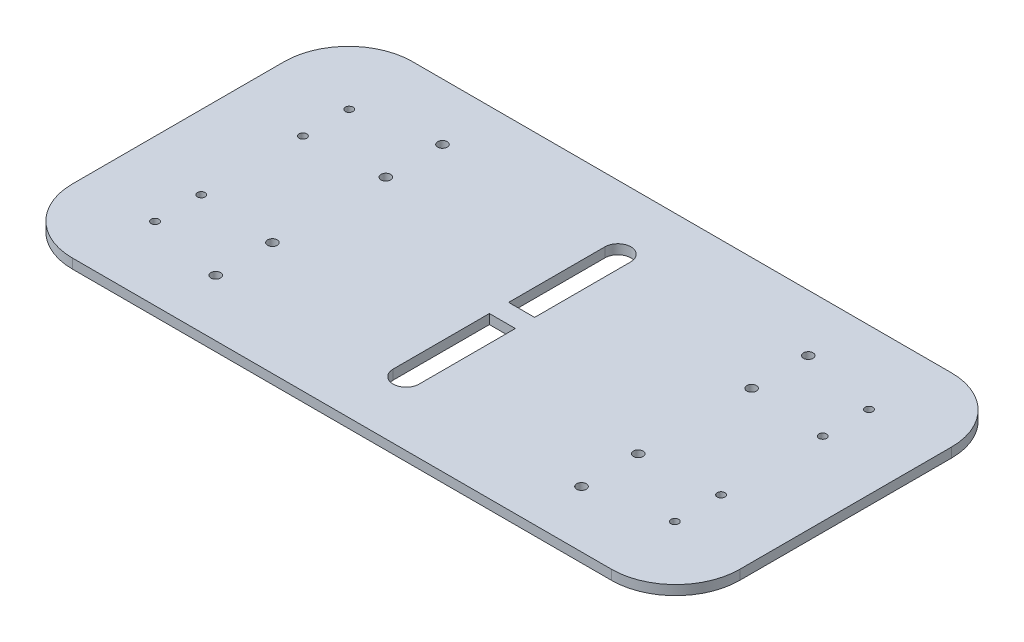
ISO-10303-21;
HEADER;
FILE_DESCRIPTION(('STEP AP214'),'2;1');
FILE_NAME('part.step','',(''),(''),'','','');
FILE_SCHEMA(('AUTOMOTIVE_DESIGN { 1 0 10303 214 1 1 1 1 }'));
ENDSEC;
DATA;
#1=APPLICATION_CONTEXT('core data for automotive mechanical design processes');
#2=APPLICATION_PROTOCOL_DEFINITION('international standard','automotive_design',2000,#1);
#3=PRODUCT_CONTEXT('',#1,'mechanical');
#4=PRODUCT('Part','Part','',(#3));
#5=PRODUCT_RELATED_PRODUCT_CATEGORY('part','',(#4));
#6=PRODUCT_DEFINITION_FORMATION('','',#4);
#7=PRODUCT_DEFINITION_CONTEXT('part definition',#1,'design');
#8=PRODUCT_DEFINITION('design','',#6,#7);
#9=PRODUCT_DEFINITION_SHAPE('','',#8);
#10=(LENGTH_UNIT() NAMED_UNIT(*) SI_UNIT(.MILLI.,.METRE.));
#11=(NAMED_UNIT(*) PLANE_ANGLE_UNIT() SI_UNIT($,.RADIAN.));
#12=(NAMED_UNIT(*) SI_UNIT($,.STERADIAN.) SOLID_ANGLE_UNIT());
#13=UNCERTAINTY_MEASURE_WITH_UNIT(LENGTH_MEASURE(1.E-05),#10,'distance_accuracy_value','');
#14=(GEOMETRIC_REPRESENTATION_CONTEXT(3) GLOBAL_UNCERTAINTY_ASSIGNED_CONTEXT((#13)) GLOBAL_UNIT_ASSIGNED_CONTEXT((#10,
#11,#12)) REPRESENTATION_CONTEXT('',''));
#15=CARTESIAN_POINT('',(0.,0.,0.));
#16=DIRECTION('',(0.,0.,1.));
#17=DIRECTION('',(1.,0.,0.));
#18=AXIS2_PLACEMENT_3D('',#15,#16,#17);
#19=CARTESIAN_POINT('',(0.,0.,0.));
#20=DIRECTION('',(0.,-1.,0.));
#21=DIRECTION('',(0.,0.,-1.));
#22=AXIS2_PLACEMENT_3D('',#19,#20,#21);
#23=PLANE('',#22);
#24=CARTESIAN_POINT('',(161.,0.,35.3333333333333));
#25=DIRECTION('',(0.,-1.,0.));
#26=DIRECTION('',(0.,0.,-1.));
#27=AXIS2_PLACEMENT_3D('',#24,#25,#26);
#28=CIRCLE('',#27,1.5);
#29=CARTESIAN_POINT('',(161.,0.,33.8333333333333));
#30=VERTEX_POINT('',#29);
#31=EDGE_CURVE('E231',#30,#30,#28,.F.);
#32=ORIENTED_EDGE('',*,*,#31,.T.);
#33=EDGE_LOOP('',(#32));
#34=FACE_BOUND('',#33,.T.);
#35=CARTESIAN_POINT('',(161.,0.,88.3333333333333));
#36=DIRECTION('',(0.,-1.,0.));
#37=DIRECTION('',(0.,0.,-1.));
#38=AXIS2_PLACEMENT_3D('',#35,#36,#37);
#39=CIRCLE('',#38,1.5);
#40=CARTESIAN_POINT('',(161.,0.,86.8333333333333));
#41=VERTEX_POINT('',#40);
#42=EDGE_CURVE('E224',#41,#41,#39,.T.);
#43=ORIENTED_EDGE('',*,*,#42,.F.);
#44=EDGE_LOOP('',(#43));
#45=FACE_BOUND('',#44,.T.);
#46=CARTESIAN_POINT('',(161.,0.,17.6666666666667));
#47=DIRECTION('',(0.,-1.,0.));
#48=DIRECTION('',(0.,0.,-1.));
#49=AXIS2_PLACEMENT_3D('',#46,#47,#48);
#50=CIRCLE('',#49,1.5);
#51=CARTESIAN_POINT('',(161.,0.,16.1666666666667));
#52=VERTEX_POINT('',#51);
#53=EDGE_CURVE('E234',#52,#52,#50,.F.);
#54=ORIENTED_EDGE('',*,*,#53,.T.);
#55=EDGE_LOOP('',(#54));
#56=FACE_BOUND('',#55,.T.);
#57=CARTESIAN_POINT('',(161.,0.,70.6666666666667));
#58=DIRECTION('',(0.,-1.,0.));
#59=DIRECTION('',(0.,0.,-1.));
#60=AXIS2_PLACEMENT_3D('',#57,#58,#59);
#61=CIRCLE('',#60,1.5);
#62=CARTESIAN_POINT('',(161.,0.,69.1666666666667));
#63=VERTEX_POINT('',#62);
#64=EDGE_CURVE('E228',#63,#63,#61,.T.);
#65=ORIENTED_EDGE('',*,*,#64,.F.);
#66=EDGE_LOOP('',(#65));
#67=FACE_BOUND('',#66,.T.);
#68=DIRECTION('',(1.,0.,0.));
#69=VECTOR('',#68,1.);
#70=CARTESIAN_POINT('',(0.,0.,106.));
#71=LINE('',#70,#69);
#72=CARTESIAN_POINT('',(20.,0.,106.));
#73=VERTEX_POINT('',#72);
#74=CARTESIAN_POINT('',(188.,0.,106.));
#75=VERTEX_POINT('',#74);
#76=EDGE_CURVE('E327',#73,#75,#71,.T.);
#77=ORIENTED_EDGE('',*,*,#76,.F.);
#78=CARTESIAN_POINT('',(20.,0.,86.));
#79=DIRECTION('',(0.,1.,0.));
#80=DIRECTION('',(0.,0.,1.));
#81=AXIS2_PLACEMENT_3D('',#78,#79,#80);
#82=CIRCLE('',#81,20.);
#83=CARTESIAN_POINT('',(0.,0.,86.));
#84=VERTEX_POINT('',#83);
#85=EDGE_CURVE('E286',#73,#84,#82,.F.);
#86=ORIENTED_EDGE('',*,*,#85,.T.);
#87=DIRECTION('',(0.,0.,-1.));
#88=VECTOR('',#87,1.);
#89=CARTESIAN_POINT('',(0.,0.,106.));
#90=LINE('',#89,#88);
#91=CARTESIAN_POINT('',(0.,0.,20.));
#92=VERTEX_POINT('',#91);
#93=EDGE_CURVE('E319',#84,#92,#90,.T.);
#94=ORIENTED_EDGE('',*,*,#93,.T.);
#95=CARTESIAN_POINT('',(20.,0.,20.));
#96=DIRECTION('',(0.,1.,0.));
#97=DIRECTION('',(0.,0.,1.));
#98=AXIS2_PLACEMENT_3D('',#95,#96,#97);
#99=CIRCLE('',#98,20.);
#100=CARTESIAN_POINT('',(20.,0.,0.));
#101=VERTEX_POINT('',#100);
#102=EDGE_CURVE('E288',#92,#101,#99,.F.);
#103=ORIENTED_EDGE('',*,*,#102,.T.);
#104=DIRECTION('',(1.,0.,0.));
#105=VECTOR('',#104,1.);
#106=CARTESIAN_POINT('',(0.,0.,0.));
#107=LINE('',#106,#105);
#108=CARTESIAN_POINT('',(188.,0.,0.));
#109=VERTEX_POINT('',#108);
#110=EDGE_CURVE('E326',#101,#109,#107,.T.);
#111=ORIENTED_EDGE('',*,*,#110,.T.);
#112=CARTESIAN_POINT('',(188.,0.,20.));
#113=DIRECTION('',(0.,1.,0.));
#114=DIRECTION('',(0.,0.,1.));
#115=AXIS2_PLACEMENT_3D('',#112,#113,#114);
#116=CIRCLE('',#115,20.);
#117=CARTESIAN_POINT('',(208.,0.,20.));
#118=VERTEX_POINT('',#117);
#119=EDGE_CURVE('E272',#109,#118,#116,.F.);
#120=ORIENTED_EDGE('',*,*,#119,.T.);
#121=DIRECTION('',(0.,0.,-1.));
#122=VECTOR('',#121,1.);
#123=CARTESIAN_POINT('',(208.,0.,106.));
#124=LINE('',#123,#122);
#125=CARTESIAN_POINT('',(208.,0.,86.));
#126=VERTEX_POINT('',#125);
#127=EDGE_CURVE('E310',#126,#118,#124,.T.);
#128=ORIENTED_EDGE('',*,*,#127,.F.);
#129=CARTESIAN_POINT('',(188.,0.,86.));
#130=DIRECTION('',(0.,1.,0.));
#131=DIRECTION('',(0.,0.,1.));
#132=AXIS2_PLACEMENT_3D('',#129,#130,#131);
#133=CIRCLE('',#132,20.);
#134=EDGE_CURVE('E274',#126,#75,#133,.F.);
#135=ORIENTED_EDGE('',*,*,#134,.T.);
#136=EDGE_LOOP('',(#77,#86,#94,#103,#111,#120,#128,#135));
#137=FACE_BOUND('',#136,.T.);
#138=DIRECTION('',(1.,0.,0.));
#139=VECTOR('',#138,1.);
#140=CARTESIAN_POINT('',(0.,0.,56.));
#141=LINE('',#140,#139);
#142=CARTESIAN_POINT('',(99.95,0.,56.));
#143=VERTEX_POINT('',#142);
#144=CARTESIAN_POINT('',(108.05,0.,56.));
#145=VERTEX_POINT('',#144);
#146=EDGE_CURVE('E249',#143,#145,#141,.T.);
#147=ORIENTED_EDGE('',*,*,#146,.F.);
#148=DIRECTION('',(0.,0.,1.));
#149=VECTOR('',#148,1.);
#150=CARTESIAN_POINT('',(99.95,0.,106.));
#151=LINE('',#150,#149);
#152=CARTESIAN_POINT('',(99.95,0.,86.));
#153=VERTEX_POINT('',#152);
#154=EDGE_CURVE('E246',#143,#153,#151,.T.);
#155=ORIENTED_EDGE('',*,*,#154,.T.);
#156=CARTESIAN_POINT('',(104.,0.,86.));
#157=DIRECTION('',(0.,1.,0.));
#158=DIRECTION('',(0.,0.,1.));
#159=AXIS2_PLACEMENT_3D('',#156,#157,#158);
#160=CIRCLE('',#159,4.04999999999998);
#161=CARTESIAN_POINT('',(108.05,0.,86.));
#162=VERTEX_POINT('',#161);
#163=EDGE_CURVE('E165',#153,#162,#160,.T.);
#164=ORIENTED_EDGE('',*,*,#163,.T.);
#165=DIRECTION('',(0.,0.,1.));
#166=VECTOR('',#165,1.);
#167=CARTESIAN_POINT('',(108.05,0.,106.));
#168=LINE('',#167,#166);
#169=EDGE_CURVE('E253',#145,#162,#168,.T.);
#170=ORIENTED_EDGE('',*,*,#169,.F.);
#171=EDGE_LOOP('',(#147,#155,#164,#170));
#172=FACE_BOUND('',#171,.T.);
#173=DIRECTION('',(0.,0.,1.));
#174=VECTOR('',#173,1.);
#175=CARTESIAN_POINT('',(108.05,0.,106.));
#176=LINE('',#175,#174);
#177=CARTESIAN_POINT('',(108.05,0.,20.));
#178=VERTEX_POINT('',#177);
#179=CARTESIAN_POINT('',(108.05,0.,50.));
#180=VERTEX_POINT('',#179);
#181=EDGE_CURVE('E261',#178,#180,#176,.T.);
#182=ORIENTED_EDGE('',*,*,#181,.F.);
#183=CARTESIAN_POINT('',(104.,0.,20.));
#184=DIRECTION('',(0.,1.,0.));
#185=DIRECTION('',(0.,0.,1.));
#186=AXIS2_PLACEMENT_3D('',#183,#184,#185);
#187=CIRCLE('',#186,4.04999999999998);
#188=CARTESIAN_POINT('',(99.95,0.,20.));
#189=VERTEX_POINT('',#188);
#190=EDGE_CURVE('E269',#178,#189,#187,.T.);
#191=ORIENTED_EDGE('',*,*,#190,.T.);
#192=DIRECTION('',(0.,0.,1.));
#193=VECTOR('',#192,1.);
#194=CARTESIAN_POINT('',(99.95,0.,106.));
#195=LINE('',#194,#193);
#196=CARTESIAN_POINT('',(99.95,0.,50.));
#197=VERTEX_POINT('',#196);
#198=EDGE_CURVE('E266',#189,#197,#195,.T.);
#199=ORIENTED_EDGE('',*,*,#198,.T.);
#200=DIRECTION('',(1.,0.,0.));
#201=VECTOR('',#200,1.);
#202=CARTESIAN_POINT('',(0.,0.,50.));
#203=LINE('',#202,#201);
#204=EDGE_CURVE('E263',#197,#180,#203,.T.);
#205=ORIENTED_EDGE('',*,*,#204,.T.);
#206=EDGE_LOOP('',(#182,#191,#199,#205));
#207=FACE_BOUND('',#206,.T.);
#208=CARTESIAN_POINT('',(185.,0.,37.16));
#209=DIRECTION('',(0.,1.,0.));
#210=DIRECTION('',(0.,0.,1.));
#211=AXIS2_PLACEMENT_3D('',#208,#209,#210);
#212=CIRCLE('',#211,1.20000000000004);
#213=CARTESIAN_POINT('',(185.,0.,38.36));
#214=VERTEX_POINT('',#213);
#215=EDGE_CURVE('E202',#214,#214,#212,.T.);
#216=ORIENTED_EDGE('',*,*,#215,.T.);
#217=EDGE_LOOP('',(#216));
#218=FACE_BOUND('',#217,.T.);
#219=CARTESIAN_POINT('',(185.,0.,68.84));
#220=DIRECTION('',(0.,1.,0.));
#221=DIRECTION('',(0.,0.,1.));
#222=AXIS2_PLACEMENT_3D('',#219,#220,#221);
#223=CIRCLE('',#222,1.20000000000004);
#224=CARTESIAN_POINT('',(185.,0.,70.0400000000001));
#225=VERTEX_POINT('',#224);
#226=EDGE_CURVE('E408',#225,#225,#223,.T.);
#227=ORIENTED_EDGE('',*,*,#226,.T.);
#228=EDGE_LOOP('',(#227));
#229=FACE_BOUND('',#228,.T.);
#230=CARTESIAN_POINT('',(185.,0.,83.26));
#231=DIRECTION('',(0.,1.,0.));
#232=DIRECTION('',(0.,0.,1.));
#233=AXIS2_PLACEMENT_3D('',#230,#231,#232);
#234=CIRCLE('',#233,1.20000000000004);
#235=CARTESIAN_POINT('',(185.,0.,84.4600000000001));
#236=VERTEX_POINT('',#235);
#237=EDGE_CURVE('E412',#236,#236,#234,.T.);
#238=ORIENTED_EDGE('',*,*,#237,.T.);
#239=EDGE_LOOP('',(#238));
#240=FACE_BOUND('',#239,.T.);
#241=CARTESIAN_POINT('',(185.,0.,22.74));
#242=DIRECTION('',(0.,1.,0.));
#243=DIRECTION('',(0.,0.,1.));
#244=AXIS2_PLACEMENT_3D('',#241,#242,#243);
#245=CIRCLE('',#244,1.20000000000004);
#246=CARTESIAN_POINT('',(185.,0.,23.94));
#247=VERTEX_POINT('',#246);
#248=EDGE_CURVE('E416',#247,#247,#245,.T.);
#249=ORIENTED_EDGE('',*,*,#248,.T.);
#250=EDGE_LOOP('',(#249));
#251=FACE_BOUND('',#250,.T.);
#252=CARTESIAN_POINT('',(47.,0.,70.6666666666667));
#253=DIRECTION('',(0.,-1.,0.));
#254=DIRECTION('',(0.,0.,-1.));
#255=AXIS2_PLACEMENT_3D('',#252,#253,#254);
#256=CIRCLE('',#255,1.5);
#257=CARTESIAN_POINT('',(47.,0.,69.1666666666667));
#258=VERTEX_POINT('',#257);
#259=EDGE_CURVE('E237',#258,#258,#256,.F.);
#260=ORIENTED_EDGE('',*,*,#259,.T.);
#261=EDGE_LOOP('',(#260));
#262=FACE_BOUND('',#261,.T.);
#263=CARTESIAN_POINT('',(47.,0.,17.6666666666667));
#264=DIRECTION('',(0.,-1.,0.));
#265=DIRECTION('',(0.,0.,-1.));
#266=AXIS2_PLACEMENT_3D('',#263,#264,#265);
#267=CIRCLE('',#266,1.5);
#268=CARTESIAN_POINT('',(47.,0.,16.1666666666667));
#269=VERTEX_POINT('',#268);
#270=EDGE_CURVE('E39',#269,#269,#267,.T.);
#271=ORIENTED_EDGE('',*,*,#270,.F.);
#272=EDGE_LOOP('',(#271));
#273=FACE_BOUND('',#272,.T.);
#274=CARTESIAN_POINT('',(47.,0.,88.3333333333333));
#275=DIRECTION('',(0.,-1.,0.));
#276=DIRECTION('',(0.,0.,-1.));
#277=AXIS2_PLACEMENT_3D('',#274,#275,#276);
#278=CIRCLE('',#277,1.5);
#279=CARTESIAN_POINT('',(47.,0.,86.8333333333333));
#280=VERTEX_POINT('',#279);
#281=EDGE_CURVE('E238',#280,#280,#278,.F.);
#282=ORIENTED_EDGE('',*,*,#281,.T.);
#283=EDGE_LOOP('',(#282));
#284=FACE_BOUND('',#283,.T.);
#285=CARTESIAN_POINT('',(47.,0.,35.3333333333333));
#286=DIRECTION('',(0.,-1.,0.));
#287=DIRECTION('',(0.,0.,-1.));
#288=AXIS2_PLACEMENT_3D('',#285,#286,#287);
#289=CIRCLE('',#288,1.5);
#290=CARTESIAN_POINT('',(47.,0.,33.8333333333333));
#291=VERTEX_POINT('',#290);
#292=EDGE_CURVE('E227',#291,#291,#289,.T.);
#293=ORIENTED_EDGE('',*,*,#292,.F.);
#294=EDGE_LOOP('',(#293));
#295=FACE_BOUND('',#294,.T.);
#296=CARTESIAN_POINT('',(23.,0.,83.26));
#297=DIRECTION('',(0.,1.,0.));
#298=DIRECTION('',(0.,0.,1.));
#299=AXIS2_PLACEMENT_3D('',#296,#297,#298);
#300=CIRCLE('',#299,1.20000000000002);
#301=CARTESIAN_POINT('',(23.,0.,84.46));
#302=VERTEX_POINT('',#301);
#303=EDGE_CURVE('E426',#302,#302,#300,.T.);
#304=ORIENTED_EDGE('',*,*,#303,.T.);
#305=EDGE_LOOP('',(#304));
#306=FACE_BOUND('',#305,.T.);
#307=CARTESIAN_POINT('',(23.,0.,37.16));
#308=DIRECTION('',(0.,1.,0.));
#309=DIRECTION('',(0.,0.,1.));
#310=AXIS2_PLACEMENT_3D('',#307,#308,#309);
#311=CIRCLE('',#310,1.20000000000002);
#312=CARTESIAN_POINT('',(23.,0.,38.36));
#313=VERTEX_POINT('',#312);
#314=EDGE_CURVE('E430',#313,#313,#311,.T.);
#315=ORIENTED_EDGE('',*,*,#314,.T.);
#316=EDGE_LOOP('',(#315));
#317=FACE_BOUND('',#316,.T.);
#318=CARTESIAN_POINT('',(23.,0.,22.74));
#319=DIRECTION('',(0.,1.,0.));
#320=DIRECTION('',(0.,0.,1.));
#321=AXIS2_PLACEMENT_3D('',#318,#319,#320);
#322=CIRCLE('',#321,1.20000000000001);
#323=CARTESIAN_POINT('',(23.,0.,23.94));
#324=VERTEX_POINT('',#323);
#325=EDGE_CURVE('E434',#324,#324,#322,.T.);
#326=ORIENTED_EDGE('',*,*,#325,.T.);
#327=EDGE_LOOP('',(#326));
#328=FACE_BOUND('',#327,.T.);
#329=CARTESIAN_POINT('',(23.,0.,68.84));
#330=DIRECTION('',(0.,1.,0.));
#331=DIRECTION('',(0.,0.,1.));
#332=AXIS2_PLACEMENT_3D('',#329,#330,#331);
#333=CIRCLE('',#332,1.20000000000002);
#334=CARTESIAN_POINT('',(23.,0.,70.04));
#335=VERTEX_POINT('',#334);
#336=EDGE_CURVE('E207',#335,#335,#333,.T.);
#337=ORIENTED_EDGE('',*,*,#336,.T.);
#338=EDGE_LOOP('',(#337));
#339=FACE_BOUND('',#338,.T.);
#340=ADVANCED_FACE('F35',(#34,#45,#56,#67,#137,#172,#207,#218,#229,#240,#251,#262,#273,#284,
#295,#306,#317,#328,#339),#23,.T.);
#341=CARTESIAN_POINT('',(0.,0.,106.));
#342=DIRECTION('',(0.,0.,1.));
#343=DIRECTION('',(1.,0.,0.));
#344=AXIS2_PLACEMENT_3D('',#341,#342,#343);
#345=PLANE('',#344);
#346=DIRECTION('',(0.,1.,0.));
#347=VECTOR('',#346,1.);
#348=CARTESIAN_POINT('',(20.,0.,106.));
#349=LINE('',#348,#347);
#350=CARTESIAN_POINT('',(20.,3.,106.));
#351=VERTEX_POINT('',#350);
#352=EDGE_CURVE('E291',#351,#73,#349,.F.);
#353=ORIENTED_EDGE('',*,*,#352,.T.);
#354=ORIENTED_EDGE('',*,*,#76,.T.);
#355=DIRECTION('',(0.,1.,0.));
#356=VECTOR('',#355,1.);
#357=CARTESIAN_POINT('',(188.,3.00000000000003,106.));
#358=LINE('',#357,#356);
#359=CARTESIAN_POINT('',(188.,3.00000000000002,106.));
#360=VERTEX_POINT('',#359);
#361=EDGE_CURVE('E294',#75,#360,#358,.T.);
#362=ORIENTED_EDGE('',*,*,#361,.T.);
#363=DIRECTION('',(1.,0.,0.));
#364=VECTOR('',#363,1.);
#365=CARTESIAN_POINT('',(0.,3.,106.));
#366=LINE('',#365,#364);
#367=EDGE_CURVE('E322',#351,#360,#366,.T.);
#368=ORIENTED_EDGE('',*,*,#367,.F.);
#369=EDGE_LOOP('',(#353,#354,#362,#368));
#370=FACE_BOUND('',#369,.T.);
#371=ADVANCED_FACE('F37',(#370),#345,.T.);
#372=CARTESIAN_POINT('',(0.,-7.,50.));
#373=DIRECTION('',(0.,0.,1.));
#374=DIRECTION('',(1.,0.,0.));
#375=AXIS2_PLACEMENT_3D('',#372,#373,#374);
#376=PLANE('',#375);
#377=DIRECTION('',(0.,1.,0.));
#378=VECTOR('',#377,1.);
#379=CARTESIAN_POINT('',(99.95,-6.99999999999999,50.));
#380=LINE('',#379,#378);
#381=CARTESIAN_POINT('',(99.95,3.00000000000001,50.));
#382=VERTEX_POINT('',#381);
#383=EDGE_CURVE('E341',#197,#382,#380,.T.);
#384=ORIENTED_EDGE('',*,*,#383,.T.);
#385=DIRECTION('',(1.,0.,0.));
#386=VECTOR('',#385,1.);
#387=CARTESIAN_POINT('',(0.,3.,50.));
#388=LINE('',#387,#386);
#389=CARTESIAN_POINT('',(108.05,3.00000000000001,50.));
#390=VERTEX_POINT('',#389);
#391=EDGE_CURVE('E338',#382,#390,#388,.T.);
#392=ORIENTED_EDGE('',*,*,#391,.T.);
#393=DIRECTION('',(0.,1.,0.));
#394=VECTOR('',#393,1.);
#395=CARTESIAN_POINT('',(108.05,-6.99999999999999,50.));
#396=LINE('',#395,#394);
#397=EDGE_CURVE('E330',#180,#390,#396,.T.);
#398=ORIENTED_EDGE('',*,*,#397,.F.);
#399=ORIENTED_EDGE('',*,*,#204,.F.);
#400=EDGE_LOOP('',(#384,#392,#398,#399));
#401=FACE_BOUND('',#400,.T.);
#402=ADVANCED_FACE('F462',(#401),#376,.F.);
#403=CARTESIAN_POINT('',(99.95,-6.99999999999999,0.));
#404=DIRECTION('',(-1.,0.,0.));
#405=DIRECTION('',(0.,-1.,0.));
#406=AXIS2_PLACEMENT_3D('',#403,#404,#405);
#407=PLANE('',#406);
#408=DIRECTION('',(0.,1.,0.));
#409=VECTOR('',#408,1.);
#410=CARTESIAN_POINT('',(99.95,-6.99999999999999,20.));
#411=LINE('',#410,#409);
#412=CARTESIAN_POINT('',(99.95,3.00000000000001,20.));
#413=VERTEX_POINT('',#412);
#414=EDGE_CURVE('E339',#189,#413,#411,.T.);
#415=ORIENTED_EDGE('',*,*,#414,.T.);
#416=DIRECTION('',(0.,0.,1.));
#417=VECTOR('',#416,1.);
#418=CARTESIAN_POINT('',(99.95,3.00000000000001,0.));
#419=LINE('',#418,#417);
#420=EDGE_CURVE('E346',#413,#382,#419,.T.);
#421=ORIENTED_EDGE('',*,*,#420,.T.);
#422=ORIENTED_EDGE('',*,*,#383,.F.);
#423=ORIENTED_EDGE('',*,*,#198,.F.);
#424=EDGE_LOOP('',(#415,#421,#422,#423));
#425=FACE_BOUND('',#424,.T.);
#426=ADVANCED_FACE('F467',(#425),#407,.F.);
#427=CARTESIAN_POINT('',(0.,-7.,56.));
#428=DIRECTION('',(0.,0.,1.));
#429=DIRECTION('',(1.,0.,0.));
#430=AXIS2_PLACEMENT_3D('',#427,#428,#429);
#431=PLANE('',#430);
#432=ORIENTED_EDGE('',*,*,#146,.T.);
#433=DIRECTION('',(0.,1.,0.));
#434=VECTOR('',#433,1.);
#435=CARTESIAN_POINT('',(108.05,-6.99999999999999,56.));
#436=LINE('',#435,#434);
#437=CARTESIAN_POINT('',(108.05,3.00000000000001,56.));
#438=VERTEX_POINT('',#437);
#439=EDGE_CURVE('E59',#145,#438,#436,.T.);
#440=ORIENTED_EDGE('',*,*,#439,.T.);
#441=DIRECTION('',(1.,0.,0.));
#442=VECTOR('',#441,1.);
#443=CARTESIAN_POINT('',(0.,3.,56.));
#444=LINE('',#443,#442);
#445=CARTESIAN_POINT('',(99.95,3.00000000000001,56.));
#446=VERTEX_POINT('',#445);
#447=EDGE_CURVE('E167',#446,#438,#444,.T.);
#448=ORIENTED_EDGE('',*,*,#447,.F.);
#449=DIRECTION('',(0.,1.,0.));
#450=VECTOR('',#449,1.);
#451=CARTESIAN_POINT('',(99.95,-6.99999999999999,56.));
#452=LINE('',#451,#450);
#453=EDGE_CURVE('E52',#143,#446,#452,.T.);
#454=ORIENTED_EDGE('',*,*,#453,.F.);
#455=EDGE_LOOP('',(#432,#440,#448,#454));
#456=FACE_BOUND('',#455,.T.);
#457=ADVANCED_FACE('F525',(#456),#431,.T.);
#458=CARTESIAN_POINT('',(108.05,-6.99999999999999,0.));
#459=DIRECTION('',(-1.,0.,0.));
#460=DIRECTION('',(0.,-1.,0.));
#461=AXIS2_PLACEMENT_3D('',#458,#459,#460);
#462=PLANE('',#461);
#463=ORIENTED_EDGE('',*,*,#169,.T.);
#464=DIRECTION('',(0.,1.,0.));
#465=VECTOR('',#464,1.);
#466=CARTESIAN_POINT('',(108.05,-6.99999999999999,86.));
#467=LINE('',#466,#465);
#468=CARTESIAN_POINT('',(108.05,3.00000000000001,86.));
#469=VERTEX_POINT('',#468);
#470=EDGE_CURVE('E166',#162,#469,#467,.T.);
#471=ORIENTED_EDGE('',*,*,#470,.T.);
#472=DIRECTION('',(0.,0.,1.));
#473=VECTOR('',#472,1.);
#474=CARTESIAN_POINT('',(108.05,3.00000000000001,0.));
#475=LINE('',#474,#473);
#476=EDGE_CURVE('E171',#438,#469,#475,.T.);
#477=ORIENTED_EDGE('',*,*,#476,.F.);
#478=ORIENTED_EDGE('',*,*,#439,.F.);
#479=EDGE_LOOP('',(#463,#471,#477,#478));
#480=FACE_BOUND('',#479,.T.);
#481=ADVANCED_FACE('F361',(#480),#462,.T.);
#482=CARTESIAN_POINT('',(0.,3.,106.));
#483=DIRECTION('',(0.,1.,0.));
#484=DIRECTION('',(-1.,0.,0.));
#485=AXIS2_PLACEMENT_3D('',#482,#483,#484);
#486=PLANE('',#485);
#487=CARTESIAN_POINT('',(23.,3.,83.26));
#488=DIRECTION('',(0.,1.,0.));
#489=DIRECTION('',(-1.,0.,0.));
#490=AXIS2_PLACEMENT_3D('',#487,#488,#489);
#491=CIRCLE('',#490,1.20000000000002);
#492=CARTESIAN_POINT('',(21.8,3.,83.26));
#493=VERTEX_POINT('',#492);
#494=EDGE_CURVE('E214',#493,#493,#491,.T.);
#495=ORIENTED_EDGE('',*,*,#494,.F.);
#496=EDGE_LOOP('',(#495));
#497=FACE_BOUND('',#496,.T.);
#498=CARTESIAN_POINT('',(23.,3.,37.16));
#499=DIRECTION('',(0.,1.,0.));
#500=DIRECTION('',(1.,0.,0.));
#501=AXIS2_PLACEMENT_3D('',#498,#499,#500);
#502=CIRCLE('',#501,1.20000000000002);
#503=CARTESIAN_POINT('',(24.2,3.,37.16));
#504=VERTEX_POINT('',#503);
#505=EDGE_CURVE('E211',#504,#504,#502,.T.);
#506=ORIENTED_EDGE('',*,*,#505,.F.);
#507=EDGE_LOOP('',(#506));
#508=FACE_BOUND('',#507,.T.);
#509=CARTESIAN_POINT('',(23.,3.,22.74));
#510=DIRECTION('',(0.,1.,0.));
#511=DIRECTION('',(1.,0.,0.));
#512=AXIS2_PLACEMENT_3D('',#509,#510,#511);
#513=CIRCLE('',#512,1.20000000000001);
#514=CARTESIAN_POINT('',(24.2,3.,22.74));
#515=VERTEX_POINT('',#514);
#516=EDGE_CURVE('E208',#515,#515,#513,.T.);
#517=ORIENTED_EDGE('',*,*,#516,.F.);
#518=EDGE_LOOP('',(#517));
#519=FACE_BOUND('',#518,.T.);
#520=CARTESIAN_POINT('',(185.,3.00000000000002,37.16));
#521=DIRECTION('',(0.,1.,0.));
#522=DIRECTION('',(-1.,0.,0.));
#523=AXIS2_PLACEMENT_3D('',#520,#521,#522);
#524=CIRCLE('',#523,1.20000000000004);
#525=CARTESIAN_POINT('',(183.8,3.00000000000002,37.16));
#526=VERTEX_POINT('',#525);
#527=EDGE_CURVE('E206',#526,#526,#524,.T.);
#528=ORIENTED_EDGE('',*,*,#527,.F.);
#529=EDGE_LOOP('',(#528));
#530=FACE_BOUND('',#529,.T.);
#531=CARTESIAN_POINT('',(185.,3.00000000000002,68.84));
#532=DIRECTION('',(0.,1.,0.));
#533=DIRECTION('',(1.,0.,0.));
#534=AXIS2_PLACEMENT_3D('',#531,#532,#533);
#535=CIRCLE('',#534,1.20000000000004);
#536=CARTESIAN_POINT('',(186.2,3.00000000000002,68.84));
#537=VERTEX_POINT('',#536);
#538=EDGE_CURVE('E11',#537,#537,#535,.T.);
#539=ORIENTED_EDGE('',*,*,#538,.F.);
#540=EDGE_LOOP('',(#539));
#541=FACE_BOUND('',#540,.T.);
#542=CARTESIAN_POINT('',(185.,3.00000000000002,83.26));
#543=DIRECTION('',(0.,1.,0.));
#544=DIRECTION('',(1.,0.,0.));
#545=AXIS2_PLACEMENT_3D('',#542,#543,#544);
#546=CIRCLE('',#545,1.20000000000004);
#547=CARTESIAN_POINT('',(186.2,3.00000000000002,83.26));
#548=VERTEX_POINT('',#547);
#549=EDGE_CURVE('E44',#548,#548,#546,.T.);
#550=ORIENTED_EDGE('',*,*,#549,.F.);
#551=EDGE_LOOP('',(#550));
#552=FACE_BOUND('',#551,.T.);
#553=CARTESIAN_POINT('',(23.,3.,68.84));
#554=DIRECTION('',(0.,1.,0.));
#555=DIRECTION('',(-1.,0.,0.));
#556=AXIS2_PLACEMENT_3D('',#553,#554,#555);
#557=CIRCLE('',#556,1.20000000000002);
#558=CARTESIAN_POINT('',(21.8,3.,68.84));
#559=VERTEX_POINT('',#558);
#560=EDGE_CURVE('E217',#559,#559,#557,.T.);
#561=ORIENTED_EDGE('',*,*,#560,.F.);
#562=EDGE_LOOP('',(#561));
#563=FACE_BOUND('',#562,.T.);
#564=CARTESIAN_POINT('',(185.,3.00000000000002,22.74));
#565=DIRECTION('',(0.,1.,0.));
#566=DIRECTION('',(-1.,0.,0.));
#567=AXIS2_PLACEMENT_3D('',#564,#565,#566);
#568=CIRCLE('',#567,1.20000000000004);
#569=CARTESIAN_POINT('',(183.8,3.00000000000002,22.74));
#570=VERTEX_POINT('',#569);
#571=EDGE_CURVE('E203',#570,#570,#568,.T.);
#572=ORIENTED_EDGE('',*,*,#571,.F.);
#573=EDGE_LOOP('',(#572));
#574=FACE_BOUND('',#573,.T.);
#575=CARTESIAN_POINT('',(47.,3.00000000000001,17.6666666666667));
#576=DIRECTION('',(0.,-1.,0.));
#577=DIRECTION('',(1.,0.,0.));
#578=AXIS2_PLACEMENT_3D('',#575,#576,#577);
#579=CIRCLE('',#578,1.5);
#580=CARTESIAN_POINT('',(48.5,3.00000000000001,17.6666666666667));
#581=VERTEX_POINT('',#580);
#582=EDGE_CURVE('E194',#581,#581,#579,.T.);
#583=ORIENTED_EDGE('',*,*,#582,.T.);
#584=EDGE_LOOP('',(#583));
#585=FACE_BOUND('',#584,.T.);
#586=DIRECTION('',(0.,0.,1.));
#587=VECTOR('',#586,1.);
#588=CARTESIAN_POINT('',(99.95,3.00000000000001,0.));
#589=LINE('',#588,#587);
#590=CARTESIAN_POINT('',(99.95,3.00000000000001,86.));
#591=VERTEX_POINT('',#590);
#592=EDGE_CURVE('E149',#446,#591,#589,.T.);
#593=ORIENTED_EDGE('',*,*,#592,.F.);
#594=ORIENTED_EDGE('',*,*,#447,.T.);
#595=ORIENTED_EDGE('',*,*,#476,.T.);
#596=CARTESIAN_POINT('',(104.,3.00000000000001,86.));
#597=DIRECTION('',(0.,1.,0.));
#598=DIRECTION('',(-1.,0.,0.));
#599=AXIS2_PLACEMENT_3D('',#596,#597,#598);
#600=CIRCLE('',#599,4.04999999999998);
#601=EDGE_CURVE('E157',#591,#469,#600,.T.);
#602=ORIENTED_EDGE('',*,*,#601,.F.);
#603=EDGE_LOOP('',(#593,#594,#595,#602));
#604=FACE_BOUND('',#603,.T.);
#605=CARTESIAN_POINT('',(47.,3.00000000000001,88.3333333333333));
#606=DIRECTION('',(0.,1.,0.));
#607=DIRECTION('',(-1.,0.,0.));
#608=AXIS2_PLACEMENT_3D('',#605,#606,#607);
#609=CIRCLE('',#608,1.5);
#610=CARTESIAN_POINT('',(45.5,3.00000000000001,88.3333333333333));
#611=VERTEX_POINT('',#610);
#612=EDGE_CURVE('E178',#611,#611,#609,.T.);
#613=ORIENTED_EDGE('',*,*,#612,.F.);
#614=EDGE_LOOP('',(#613));
#615=FACE_BOUND('',#614,.T.);
#616=CARTESIAN_POINT('',(47.,3.00000000000001,70.6666666666667));
#617=DIRECTION('',(0.,1.,0.));
#618=DIRECTION('',(-1.,0.,0.));
#619=AXIS2_PLACEMENT_3D('',#616,#617,#618);
#620=CIRCLE('',#619,1.5);
#621=CARTESIAN_POINT('',(45.5,3.00000000000001,70.6666666666667));
#622=VERTEX_POINT('',#621);
#623=EDGE_CURVE('E185',#622,#622,#620,.T.);
#624=ORIENTED_EDGE('',*,*,#623,.F.);
#625=EDGE_LOOP('',(#624));
#626=FACE_BOUND('',#625,.T.);
#627=CARTESIAN_POINT('',(47.,3.00000000000001,35.3333333333333));
#628=DIRECTION('',(0.,-1.,0.));
#629=DIRECTION('',(1.,0.,0.));
#630=AXIS2_PLACEMENT_3D('',#627,#628,#629);
#631=CIRCLE('',#630,1.5);
#632=CARTESIAN_POINT('',(48.5,3.00000000000001,35.3333333333333));
#633=VERTEX_POINT('',#632);
#634=EDGE_CURVE('E197',#633,#633,#631,.T.);
#635=ORIENTED_EDGE('',*,*,#634,.T.);
#636=EDGE_LOOP('',(#635));
#637=FACE_BOUND('',#636,.T.);
#638=DIRECTION('',(0.,0.,-1.));
#639=VECTOR('',#638,1.);
#640=CARTESIAN_POINT('',(0.,3.,106.));
#641=LINE('',#640,#639);
#642=CARTESIAN_POINT('',(0.,3.,86.));
#643=VERTEX_POINT('',#642);
#644=CARTESIAN_POINT('',(0.,3.,20.));
#645=VERTEX_POINT('',#644);
#646=EDGE_CURVE('E316',#643,#645,#641,.T.);
#647=ORIENTED_EDGE('',*,*,#646,.F.);
#648=CARTESIAN_POINT('',(20.,3.,86.));
#649=DIRECTION('',(0.,1.,0.));
#650=DIRECTION('',(-1.,0.,0.));
#651=AXIS2_PLACEMENT_3D('',#648,#649,#650);
#652=CIRCLE('',#651,20.);
#653=EDGE_CURVE('E297',#643,#351,#652,.T.);
#654=ORIENTED_EDGE('',*,*,#653,.T.);
#655=ORIENTED_EDGE('',*,*,#367,.T.);
#656=CARTESIAN_POINT('',(188.,3.00000000000002,86.));
#657=DIRECTION('',(0.,1.,0.));
#658=DIRECTION('',(-1.,0.,0.));
#659=AXIS2_PLACEMENT_3D('',#656,#657,#658);
#660=CIRCLE('',#659,20.);
#661=CARTESIAN_POINT('',(208.,3.00000000000003,86.));
#662=VERTEX_POINT('',#661);
#663=EDGE_CURVE('E303',#360,#662,#660,.T.);
#664=ORIENTED_EDGE('',*,*,#663,.T.);
#665=DIRECTION('',(0.,0.,-1.));
#666=VECTOR('',#665,1.);
#667=CARTESIAN_POINT('',(208.,3.00000000000003,106.));
#668=LINE('',#667,#666);
#669=CARTESIAN_POINT('',(208.,3.00000000000003,20.));
#670=VERTEX_POINT('',#669);
#671=EDGE_CURVE('E313',#662,#670,#668,.T.);
#672=ORIENTED_EDGE('',*,*,#671,.T.);
#673=CARTESIAN_POINT('',(188.,3.00000000000002,20.));
#674=DIRECTION('',(0.,1.,0.));
#675=DIRECTION('',(-1.,0.,0.));
#676=AXIS2_PLACEMENT_3D('',#673,#674,#675);
#677=CIRCLE('',#676,20.);
#678=CARTESIAN_POINT('',(188.,3.00000000000002,0.));
#679=VERTEX_POINT('',#678);
#680=EDGE_CURVE('E301',#670,#679,#677,.T.);
#681=ORIENTED_EDGE('',*,*,#680,.T.);
#682=DIRECTION('',(1.,0.,0.));
#683=VECTOR('',#682,1.);
#684=CARTESIAN_POINT('',(0.,3.,0.));
#685=LINE('',#684,#683);
#686=CARTESIAN_POINT('',(20.,3.,0.));
#687=VERTEX_POINT('',#686);
#688=EDGE_CURVE('E323',#687,#679,#685,.T.);
#689=ORIENTED_EDGE('',*,*,#688,.F.);
#690=CARTESIAN_POINT('',(20.,3.,20.));
#691=DIRECTION('',(0.,1.,0.));
#692=DIRECTION('',(-1.,0.,0.));
#693=AXIS2_PLACEMENT_3D('',#690,#691,#692);
#694=CIRCLE('',#693,20.);
#695=EDGE_CURVE('E299',#687,#645,#694,.T.);
#696=ORIENTED_EDGE('',*,*,#695,.T.);
#697=EDGE_LOOP('',(#647,#654,#655,#664,#672,#681,#689,#696));
#698=FACE_BOUND('',#697,.T.);
#699=CARTESIAN_POINT('',(104.,3.00000000000001,20.));
#700=DIRECTION('',(0.,1.,0.));
#701=DIRECTION('',(-1.,0.,0.));
#702=AXIS2_PLACEMENT_3D('',#699,#700,#701);
#703=CIRCLE('',#702,4.04999999999998);
#704=CARTESIAN_POINT('',(108.05,3.00000000000001,20.));
#705=VERTEX_POINT('',#704);
#706=EDGE_CURVE('E349',#705,#413,#703,.T.);
#707=ORIENTED_EDGE('',*,*,#706,.F.);
#708=DIRECTION('',(0.,0.,1.));
#709=VECTOR('',#708,1.);
#710=CARTESIAN_POINT('',(108.05,3.00000000000001,0.));
#711=LINE('',#710,#709);
#712=EDGE_CURVE('E158',#705,#390,#711,.T.);
#713=ORIENTED_EDGE('',*,*,#712,.T.);
#714=ORIENTED_EDGE('',*,*,#391,.F.);
#715=ORIENTED_EDGE('',*,*,#420,.F.);
#716=EDGE_LOOP('',(#707,#713,#714,#715));
#717=FACE_BOUND('',#716,.T.);
#718=CARTESIAN_POINT('',(161.,3.00000000000002,70.6666666666667));
#719=DIRECTION('',(0.,-1.,0.));
#720=DIRECTION('',(1.,0.,0.));
#721=AXIS2_PLACEMENT_3D('',#718,#719,#720);
#722=CIRCLE('',#721,1.5);
#723=CARTESIAN_POINT('',(162.5,3.00000000000002,70.6666666666667));
#724=VERTEX_POINT('',#723);
#725=EDGE_CURVE('E181',#724,#724,#722,.T.);
#726=ORIENTED_EDGE('',*,*,#725,.T.);
#727=EDGE_LOOP('',(#726));
#728=FACE_BOUND('',#727,.T.);
#729=CARTESIAN_POINT('',(161.,3.00000000000002,35.3333333333333));
#730=DIRECTION('',(0.,1.,0.));
#731=DIRECTION('',(-1.,0.,0.));
#732=AXIS2_PLACEMENT_3D('',#729,#730,#731);
#733=CIRCLE('',#732,1.5);
#734=CARTESIAN_POINT('',(159.5,3.00000000000002,35.3333333333333));
#735=VERTEX_POINT('',#734);
#736=EDGE_CURVE('E191',#735,#735,#733,.T.);
#737=ORIENTED_EDGE('',*,*,#736,.F.);
#738=EDGE_LOOP('',(#737));
#739=FACE_BOUND('',#738,.T.);
#740=CARTESIAN_POINT('',(161.,3.00000000000002,17.6666666666667));
#741=DIRECTION('',(0.,1.,0.));
#742=DIRECTION('',(-1.,0.,0.));
#743=AXIS2_PLACEMENT_3D('',#740,#741,#742);
#744=CIRCLE('',#743,1.5);
#745=CARTESIAN_POINT('',(159.5,3.00000000000002,17.6666666666667));
#746=VERTEX_POINT('',#745);
#747=EDGE_CURVE('E188',#746,#746,#744,.T.);
#748=ORIENTED_EDGE('',*,*,#747,.F.);
#749=EDGE_LOOP('',(#748));
#750=FACE_BOUND('',#749,.T.);
#751=CARTESIAN_POINT('',(161.,3.00000000000002,88.3333333333333));
#752=DIRECTION('',(0.,-1.,0.));
#753=DIRECTION('',(1.,0.,0.));
#754=AXIS2_PLACEMENT_3D('',#751,#752,#753);
#755=CIRCLE('',#754,1.5);
#756=CARTESIAN_POINT('',(162.5,3.00000000000002,88.3333333333333));
#757=VERTEX_POINT('',#756);
#758=EDGE_CURVE('E184',#757,#757,#755,.T.);
#759=ORIENTED_EDGE('',*,*,#758,.T.);
#760=EDGE_LOOP('',(#759));
#761=FACE_BOUND('',#760,.T.);
#762=ADVANCED_FACE('F169',(#497,#508,#519,#530,#541,#552,#563,#574,#585,#604,#615,#626,#637,
#698,#717,#728,#739,#750,#761),#486,.T.);
#763=CARTESIAN_POINT('',(185.,-6.99999999999998,37.16));
#764=DIRECTION('',(0.,1.,0.));
#765=DIRECTION('',(-1.,0.,0.));
#766=AXIS2_PLACEMENT_3D('',#763,#764,#765);
#767=CYLINDRICAL_SURFACE('',#766,1.20000000000004);
#768=ORIENTED_EDGE('',*,*,#527,.T.);
#769=EDGE_LOOP('',(#768));
#770=FACE_BOUND('',#769,.T.);
#771=ORIENTED_EDGE('',*,*,#215,.F.);
#772=EDGE_LOOP('',(#771));
#773=FACE_BOUND('',#772,.T.);
#774=ADVANCED_FACE('F360',(#770,#773),#767,.F.);
#775=CARTESIAN_POINT('',(185.,-6.99999999999998,68.84));
#776=DIRECTION('',(0.,1.,0.));
#777=DIRECTION('',(-1.,0.,0.));
#778=AXIS2_PLACEMENT_3D('',#775,#776,#777);
#779=CYLINDRICAL_SURFACE('',#778,1.20000000000004);
#780=ORIENTED_EDGE('',*,*,#538,.T.);
#781=EDGE_LOOP('',(#780));
#782=FACE_BOUND('',#781,.T.);
#783=ORIENTED_EDGE('',*,*,#226,.F.);
#784=EDGE_LOOP('',(#783));
#785=FACE_BOUND('',#784,.T.);
#786=ADVANCED_FACE('F546',(#782,#785),#779,.F.);
#787=CARTESIAN_POINT('',(185.,-6.99999999999998,83.26));
#788=DIRECTION('',(0.,1.,0.));
#789=DIRECTION('',(-1.,0.,0.));
#790=AXIS2_PLACEMENT_3D('',#787,#788,#789);
#791=CYLINDRICAL_SURFACE('',#790,1.20000000000004);
#792=ORIENTED_EDGE('',*,*,#549,.T.);
#793=EDGE_LOOP('',(#792));
#794=FACE_BOUND('',#793,.T.);
#795=ORIENTED_EDGE('',*,*,#237,.F.);
#796=EDGE_LOOP('',(#795));
#797=FACE_BOUND('',#796,.T.);
#798=ADVANCED_FACE('F541',(#794,#797),#791,.F.);
#799=CARTESIAN_POINT('',(185.,-6.99999999999998,22.74));
#800=DIRECTION('',(0.,1.,0.));
#801=DIRECTION('',(-1.,0.,0.));
#802=AXIS2_PLACEMENT_3D('',#799,#800,#801);
#803=CYLINDRICAL_SURFACE('',#802,1.20000000000004);
#804=ORIENTED_EDGE('',*,*,#571,.T.);
#805=EDGE_LOOP('',(#804));
#806=FACE_BOUND('',#805,.T.);
#807=ORIENTED_EDGE('',*,*,#248,.F.);
#808=EDGE_LOOP('',(#807));
#809=FACE_BOUND('',#808,.T.);
#810=ADVANCED_FACE('F538',(#806,#809),#803,.F.);
#811=CARTESIAN_POINT('',(23.,-7.,83.26));
#812=DIRECTION('',(0.,1.,0.));
#813=DIRECTION('',(-1.,0.,0.));
#814=AXIS2_PLACEMENT_3D('',#811,#812,#813);
#815=CYLINDRICAL_SURFACE('',#814,1.20000000000002);
#816=ORIENTED_EDGE('',*,*,#494,.T.);
#817=EDGE_LOOP('',(#816));
#818=FACE_BOUND('',#817,.T.);
#819=ORIENTED_EDGE('',*,*,#303,.F.);
#820=EDGE_LOOP('',(#819));
#821=FACE_BOUND('',#820,.T.);
#822=ADVANCED_FACE('F540',(#818,#821),#815,.F.);
#823=CARTESIAN_POINT('',(23.,-7.,37.16));
#824=DIRECTION('',(0.,1.,0.));
#825=DIRECTION('',(-1.,0.,0.));
#826=AXIS2_PLACEMENT_3D('',#823,#824,#825);
#827=CYLINDRICAL_SURFACE('',#826,1.20000000000002);
#828=ORIENTED_EDGE('',*,*,#505,.T.);
#829=EDGE_LOOP('',(#828));
#830=FACE_BOUND('',#829,.T.);
#831=ORIENTED_EDGE('',*,*,#314,.F.);
#832=EDGE_LOOP('',(#831));
#833=FACE_BOUND('',#832,.T.);
#834=ADVANCED_FACE('F456',(#830,#833),#827,.F.);
#835=CARTESIAN_POINT('',(23.,-7.,22.74));
#836=DIRECTION('',(0.,1.,0.));
#837=DIRECTION('',(-1.,0.,0.));
#838=AXIS2_PLACEMENT_3D('',#835,#836,#837);
#839=CYLINDRICAL_SURFACE('',#838,1.20000000000001);
#840=ORIENTED_EDGE('',*,*,#516,.T.);
#841=EDGE_LOOP('',(#840));
#842=FACE_BOUND('',#841,.T.);
#843=ORIENTED_EDGE('',*,*,#325,.F.);
#844=EDGE_LOOP('',(#843));
#845=FACE_BOUND('',#844,.T.);
#846=ADVANCED_FACE('F447',(#842,#845),#839,.F.);
#847=CARTESIAN_POINT('',(23.,-7.,68.84));
#848=DIRECTION('',(0.,1.,0.));
#849=DIRECTION('',(-1.,0.,0.));
#850=AXIS2_PLACEMENT_3D('',#847,#848,#849);
#851=CYLINDRICAL_SURFACE('',#850,1.20000000000002);
#852=ORIENTED_EDGE('',*,*,#560,.T.);
#853=EDGE_LOOP('',(#852));
#854=FACE_BOUND('',#853,.T.);
#855=ORIENTED_EDGE('',*,*,#336,.F.);
#856=EDGE_LOOP('',(#855));
#857=FACE_BOUND('',#856,.T.);
#858=ADVANCED_FACE('F444',(#854,#857),#851,.F.);
#859=CARTESIAN_POINT('',(47.,-6.99999999999999,17.6666666666667));
#860=DIRECTION('',(0.,1.,0.));
#861=DIRECTION('',(-1.,0.,0.));
#862=AXIS2_PLACEMENT_3D('',#859,#860,#861);
#863=CYLINDRICAL_SURFACE('',#862,1.5);
#864=ORIENTED_EDGE('',*,*,#582,.F.);
#865=EDGE_LOOP('',(#864));
#866=FACE_BOUND('',#865,.T.);
#867=ORIENTED_EDGE('',*,*,#270,.T.);
#868=EDGE_LOOP('',(#867));
#869=FACE_BOUND('',#868,.T.);
#870=ADVANCED_FACE('F446',(#866,#869),#863,.F.);
#871=CARTESIAN_POINT('',(47.,-6.99999999999999,88.3333333333333));
#872=DIRECTION('',(0.,1.,0.));
#873=DIRECTION('',(-1.,0.,0.));
#874=AXIS2_PLACEMENT_3D('',#871,#872,#873);
#875=CYLINDRICAL_SURFACE('',#874,1.5);
#876=ORIENTED_EDGE('',*,*,#612,.T.);
#877=EDGE_LOOP('',(#876));
#878=FACE_BOUND('',#877,.T.);
#879=ORIENTED_EDGE('',*,*,#281,.F.);
#880=EDGE_LOOP('',(#879));
#881=FACE_BOUND('',#880,.T.);
#882=ADVANCED_FACE('F356',(#878,#881),#875,.F.);
#883=CARTESIAN_POINT('',(47.,-6.99999999999999,70.6666666666667));
#884=DIRECTION('',(0.,1.,0.));
#885=DIRECTION('',(-1.,0.,0.));
#886=AXIS2_PLACEMENT_3D('',#883,#884,#885);
#887=CYLINDRICAL_SURFACE('',#886,1.5);
#888=ORIENTED_EDGE('',*,*,#623,.T.);
#889=EDGE_LOOP('',(#888));
#890=FACE_BOUND('',#889,.T.);
#891=ORIENTED_EDGE('',*,*,#259,.F.);
#892=EDGE_LOOP('',(#891));
#893=FACE_BOUND('',#892,.T.);
#894=ADVANCED_FACE('F585',(#890,#893),#887,.F.);
#895=CARTESIAN_POINT('',(47.,-6.99999999999999,35.3333333333333));
#896=DIRECTION('',(0.,1.,0.));
#897=DIRECTION('',(-1.,0.,0.));
#898=AXIS2_PLACEMENT_3D('',#895,#896,#897);
#899=CYLINDRICAL_SURFACE('',#898,1.5);
#900=ORIENTED_EDGE('',*,*,#634,.F.);
#901=EDGE_LOOP('',(#900));
#902=FACE_BOUND('',#901,.T.);
#903=ORIENTED_EDGE('',*,*,#292,.T.);
#904=EDGE_LOOP('',(#903));
#905=FACE_BOUND('',#904,.T.);
#906=ADVANCED_FACE('F537',(#902,#905),#899,.F.);
#907=CARTESIAN_POINT('',(99.95,-6.99999999999999,0.));
#908=DIRECTION('',(-1.,0.,0.));
#909=DIRECTION('',(0.,-1.,0.));
#910=AXIS2_PLACEMENT_3D('',#907,#908,#909);
#911=PLANE('',#910);
#912=ORIENTED_EDGE('',*,*,#453,.T.);
#913=ORIENTED_EDGE('',*,*,#592,.T.);
#914=DIRECTION('',(0.,1.,0.));
#915=VECTOR('',#914,1.);
#916=CARTESIAN_POINT('',(99.95,-6.99999999999999,86.));
#917=LINE('',#916,#915);
#918=EDGE_CURVE('E152',#153,#591,#917,.T.);
#919=ORIENTED_EDGE('',*,*,#918,.F.);
#920=ORIENTED_EDGE('',*,*,#154,.F.);
#921=EDGE_LOOP('',(#912,#913,#919,#920));
#922=FACE_BOUND('',#921,.T.);
#923=ADVANCED_FACE('F151',(#922),#911,.F.);
#924=CARTESIAN_POINT('',(104.,-6.99999999999999,86.));
#925=DIRECTION('',(0.,1.,0.));
#926=DIRECTION('',(-1.,0.,0.));
#927=AXIS2_PLACEMENT_3D('',#924,#925,#926);
#928=CYLINDRICAL_SURFACE('',#927,4.04999999999998);
#929=ORIENTED_EDGE('',*,*,#918,.T.);
#930=ORIENTED_EDGE('',*,*,#601,.T.);
#931=ORIENTED_EDGE('',*,*,#470,.F.);
#932=ORIENTED_EDGE('',*,*,#163,.F.);
#933=EDGE_LOOP('',(#929,#930,#931,#932));
#934=FACE_BOUND('',#933,.T.);
#935=ADVANCED_FACE('F162',(#934),#928,.F.);
#936=CARTESIAN_POINT('',(108.05,-6.99999999999999,0.));
#937=DIRECTION('',(-1.,0.,0.));
#938=DIRECTION('',(0.,-1.,0.));
#939=AXIS2_PLACEMENT_3D('',#936,#937,#938);
#940=PLANE('',#939);
#941=ORIENTED_EDGE('',*,*,#181,.T.);
#942=ORIENTED_EDGE('',*,*,#397,.T.);
#943=ORIENTED_EDGE('',*,*,#712,.F.);
#944=DIRECTION('',(0.,1.,0.));
#945=VECTOR('',#944,1.);
#946=CARTESIAN_POINT('',(108.05,-6.99999999999999,20.));
#947=LINE('',#946,#945);
#948=EDGE_CURVE('E335',#178,#705,#947,.T.);
#949=ORIENTED_EDGE('',*,*,#948,.F.);
#950=EDGE_LOOP('',(#941,#942,#943,#949));
#951=FACE_BOUND('',#950,.T.);
#952=ADVANCED_FACE('F517',(#951),#940,.T.);
#953=CARTESIAN_POINT('',(104.,-6.99999999999999,20.));
#954=DIRECTION('',(0.,1.,0.));
#955=DIRECTION('',(-1.,0.,0.));
#956=AXIS2_PLACEMENT_3D('',#953,#954,#955);
#957=CYLINDRICAL_SURFACE('',#956,4.04999999999998);
#958=ORIENTED_EDGE('',*,*,#948,.T.);
#959=ORIENTED_EDGE('',*,*,#706,.T.);
#960=ORIENTED_EDGE('',*,*,#414,.F.);
#961=ORIENTED_EDGE('',*,*,#190,.F.);
#962=EDGE_LOOP('',(#958,#959,#960,#961));
#963=FACE_BOUND('',#962,.T.);
#964=ADVANCED_FACE('F385',(#963),#957,.F.);
#965=CARTESIAN_POINT('',(161.,-6.99999999999998,88.3333333333333));
#966=DIRECTION('',(0.,1.,0.));
#967=DIRECTION('',(-1.,0.,0.));
#968=AXIS2_PLACEMENT_3D('',#965,#966,#967);
#969=CYLINDRICAL_SURFACE('',#968,1.5);
#970=ORIENTED_EDGE('',*,*,#758,.F.);
#971=EDGE_LOOP('',(#970));
#972=FACE_BOUND('',#971,.T.);
#973=ORIENTED_EDGE('',*,*,#42,.T.);
#974=EDGE_LOOP('',(#973));
#975=FACE_BOUND('',#974,.T.);
#976=ADVANCED_FACE('F381',(#972,#975),#969,.F.);
#977=CARTESIAN_POINT('',(161.,-6.99999999999998,17.6666666666667));
#978=DIRECTION('',(0.,1.,0.));
#979=DIRECTION('',(-1.,0.,0.));
#980=AXIS2_PLACEMENT_3D('',#977,#978,#979);
#981=CYLINDRICAL_SURFACE('',#980,1.5);
#982=ORIENTED_EDGE('',*,*,#747,.T.);
#983=EDGE_LOOP('',(#982));
#984=FACE_BOUND('',#983,.T.);
#985=ORIENTED_EDGE('',*,*,#53,.F.);
#986=EDGE_LOOP('',(#985));
#987=FACE_BOUND('',#986,.T.);
#988=ADVANCED_FACE('F384',(#984,#987),#981,.F.);
#989=CARTESIAN_POINT('',(161.,-6.99999999999998,35.3333333333333));
#990=DIRECTION('',(0.,1.,0.));
#991=DIRECTION('',(-1.,0.,0.));
#992=AXIS2_PLACEMENT_3D('',#989,#990,#991);
#993=CYLINDRICAL_SURFACE('',#992,1.5);
#994=ORIENTED_EDGE('',*,*,#736,.T.);
#995=EDGE_LOOP('',(#994));
#996=FACE_BOUND('',#995,.T.);
#997=ORIENTED_EDGE('',*,*,#31,.F.);
#998=EDGE_LOOP('',(#997));
#999=FACE_BOUND('',#998,.T.);
#1000=ADVANCED_FACE('F575',(#996,#999),#993,.F.);
#1001=CARTESIAN_POINT('',(161.,-6.99999999999998,70.6666666666667));
#1002=DIRECTION('',(0.,1.,0.));
#1003=DIRECTION('',(-1.,0.,0.));
#1004=AXIS2_PLACEMENT_3D('',#1001,#1002,#1003);
#1005=CYLINDRICAL_SURFACE('',#1004,1.5);
#1006=ORIENTED_EDGE('',*,*,#725,.F.);
#1007=EDGE_LOOP('',(#1006));
#1008=FACE_BOUND('',#1007,.T.);
#1009=ORIENTED_EDGE('',*,*,#64,.T.);
#1010=EDGE_LOOP('',(#1009));
#1011=FACE_BOUND('',#1010,.T.);
#1012=ADVANCED_FACE('F506',(#1008,#1011),#1005,.F.);
#1013=CARTESIAN_POINT('',(208.,0.,106.));
#1014=DIRECTION('',(-1.,0.,0.));
#1015=DIRECTION('',(0.,0.,1.));
#1016=AXIS2_PLACEMENT_3D('',#1013,#1014,#1015);
#1017=PLANE('',#1016);
#1018=ORIENTED_EDGE('',*,*,#127,.T.);
#1019=DIRECTION('',(0.,1.,0.));
#1020=VECTOR('',#1019,1.);
#1021=CARTESIAN_POINT('',(208.,0.,20.));
#1022=LINE('',#1021,#1020);
#1023=EDGE_CURVE('E276',#118,#670,#1022,.T.);
#1024=ORIENTED_EDGE('',*,*,#1023,.T.);
#1025=ORIENTED_EDGE('',*,*,#671,.F.);
#1026=DIRECTION('',(0.,1.,0.));
#1027=VECTOR('',#1026,1.);
#1028=CARTESIAN_POINT('',(208.,0.,86.));
#1029=LINE('',#1028,#1027);
#1030=EDGE_CURVE('E279',#662,#126,#1029,.F.);
#1031=ORIENTED_EDGE('',*,*,#1030,.T.);
#1032=EDGE_LOOP('',(#1018,#1024,#1025,#1031));
#1033=FACE_BOUND('',#1032,.T.);
#1034=ADVANCED_FACE('F493',(#1033),#1017,.F.);
#1035=CARTESIAN_POINT('',(188.,0.,86.));
#1036=DIRECTION('',(0.,-1.,0.));
#1037=DIRECTION('',(0.,0.,-1.));
#1038=AXIS2_PLACEMENT_3D('',#1035,#1036,#1037);
#1039=CYLINDRICAL_SURFACE('',#1038,20.);
#1040=ORIENTED_EDGE('',*,*,#134,.F.);
#1041=ORIENTED_EDGE('',*,*,#1030,.F.);
#1042=ORIENTED_EDGE('',*,*,#663,.F.);
#1043=ORIENTED_EDGE('',*,*,#361,.F.);
#1044=EDGE_LOOP('',(#1040,#1041,#1042,#1043));
#1045=FACE_BOUND('',#1044,.T.);
#1046=ADVANCED_FACE('F498',(#1045),#1039,.T.);
#1047=CARTESIAN_POINT('',(0.,0.,0.));
#1048=DIRECTION('',(0.,0.,1.));
#1049=DIRECTION('',(1.,0.,0.));
#1050=AXIS2_PLACEMENT_3D('',#1047,#1048,#1049);
#1051=PLANE('',#1050);
#1052=ORIENTED_EDGE('',*,*,#110,.F.);
#1053=DIRECTION('',(0.,1.,0.));
#1054=VECTOR('',#1053,1.);
#1055=CARTESIAN_POINT('',(20.,3.,0.));
#1056=LINE('',#1055,#1054);
#1057=EDGE_CURVE('E281',#101,#687,#1056,.T.);
#1058=ORIENTED_EDGE('',*,*,#1057,.T.);
#1059=ORIENTED_EDGE('',*,*,#688,.T.);
#1060=DIRECTION('',(0.,1.,0.));
#1061=VECTOR('',#1060,1.);
#1062=CARTESIAN_POINT('',(188.,0.,0.));
#1063=LINE('',#1062,#1061);
#1064=EDGE_CURVE('E284',#679,#109,#1063,.F.);
#1065=ORIENTED_EDGE('',*,*,#1064,.T.);
#1066=EDGE_LOOP('',(#1052,#1058,#1059,#1065));
#1067=FACE_BOUND('',#1066,.T.);
#1068=ADVANCED_FACE('F500',(#1067),#1051,.F.);
#1069=CARTESIAN_POINT('',(188.,0.,20.));
#1070=DIRECTION('',(0.,1.,0.));
#1071=DIRECTION('',(0.,0.,1.));
#1072=AXIS2_PLACEMENT_3D('',#1069,#1070,#1071);
#1073=CYLINDRICAL_SURFACE('',#1072,20.);
#1074=ORIENTED_EDGE('',*,*,#119,.F.);
#1075=ORIENTED_EDGE('',*,*,#1064,.F.);
#1076=ORIENTED_EDGE('',*,*,#680,.F.);
#1077=ORIENTED_EDGE('',*,*,#1023,.F.);
#1078=EDGE_LOOP('',(#1074,#1075,#1076,#1077));
#1079=FACE_BOUND('',#1078,.T.);
#1080=ADVANCED_FACE('F490',(#1079),#1073,.T.);
#1081=CARTESIAN_POINT('',(0.,0.,106.));
#1082=DIRECTION('',(-1.,0.,0.));
#1083=DIRECTION('',(0.,0.,1.));
#1084=AXIS2_PLACEMENT_3D('',#1081,#1082,#1083);
#1085=PLANE('',#1084);
#1086=ORIENTED_EDGE('',*,*,#93,.F.);
#1087=DIRECTION('',(0.,1.,0.));
#1088=VECTOR('',#1087,1.);
#1089=CARTESIAN_POINT('',(0.,0.,86.));
#1090=LINE('',#1089,#1088);
#1091=EDGE_CURVE('E305',#84,#643,#1090,.T.);
#1092=ORIENTED_EDGE('',*,*,#1091,.T.);
#1093=ORIENTED_EDGE('',*,*,#646,.T.);
#1094=DIRECTION('',(0.,1.,0.));
#1095=VECTOR('',#1094,1.);
#1096=CARTESIAN_POINT('',(0.,0.,20.));
#1097=LINE('',#1096,#1095);
#1098=EDGE_CURVE('E308',#645,#92,#1097,.F.);
#1099=ORIENTED_EDGE('',*,*,#1098,.T.);
#1100=EDGE_LOOP('',(#1086,#1092,#1093,#1099));
#1101=FACE_BOUND('',#1100,.T.);
#1102=ADVANCED_FACE('F479',(#1101),#1085,.T.);
#1103=CARTESIAN_POINT('',(20.,0.,20.));
#1104=DIRECTION('',(0.,-1.,0.));
#1105=DIRECTION('',(0.,0.,-1.));
#1106=AXIS2_PLACEMENT_3D('',#1103,#1104,#1105);
#1107=CYLINDRICAL_SURFACE('',#1106,20.);
#1108=ORIENTED_EDGE('',*,*,#102,.F.);
#1109=ORIENTED_EDGE('',*,*,#1098,.F.);
#1110=ORIENTED_EDGE('',*,*,#695,.F.);
#1111=ORIENTED_EDGE('',*,*,#1057,.F.);
#1112=EDGE_LOOP('',(#1108,#1109,#1110,#1111));
#1113=FACE_BOUND('',#1112,.T.);
#1114=ADVANCED_FACE('F482',(#1113),#1107,.T.);
#1115=CARTESIAN_POINT('',(20.,0.,86.));
#1116=DIRECTION('',(0.,1.,0.));
#1117=DIRECTION('',(0.,0.,1.));
#1118=AXIS2_PLACEMENT_3D('',#1115,#1116,#1117);
#1119=CYLINDRICAL_SURFACE('',#1118,20.);
#1120=ORIENTED_EDGE('',*,*,#85,.F.);
#1121=ORIENTED_EDGE('',*,*,#352,.F.);
#1122=ORIENTED_EDGE('',*,*,#653,.F.);
#1123=ORIENTED_EDGE('',*,*,#1091,.F.);
#1124=EDGE_LOOP('',(#1120,#1121,#1122,#1123));
#1125=FACE_BOUND('',#1124,.T.);
#1126=ADVANCED_FACE('F393',(#1125),#1119,.T.);
#1127=CLOSED_SHELL('',(#340,#371,#402,#426,#457,#481,#762,#774,#786,#798,#810,#822,#834,#846,
#858,#870,#882,#894,#906,#923,#935,#952,#964,#976,#988,#1000,#1012,#1034,#1046,#1068,#1080,
#1102,#1114,#1126));
#1128=MANIFOLD_SOLID_BREP('B2',#1127);
#1129=ADVANCED_BREP_SHAPE_REPRESENTATION('',(#18,#1128),#14);
#1130=SHAPE_DEFINITION_REPRESENTATION(#9,#1129);
ENDSEC;
END-ISO-10303-21;
